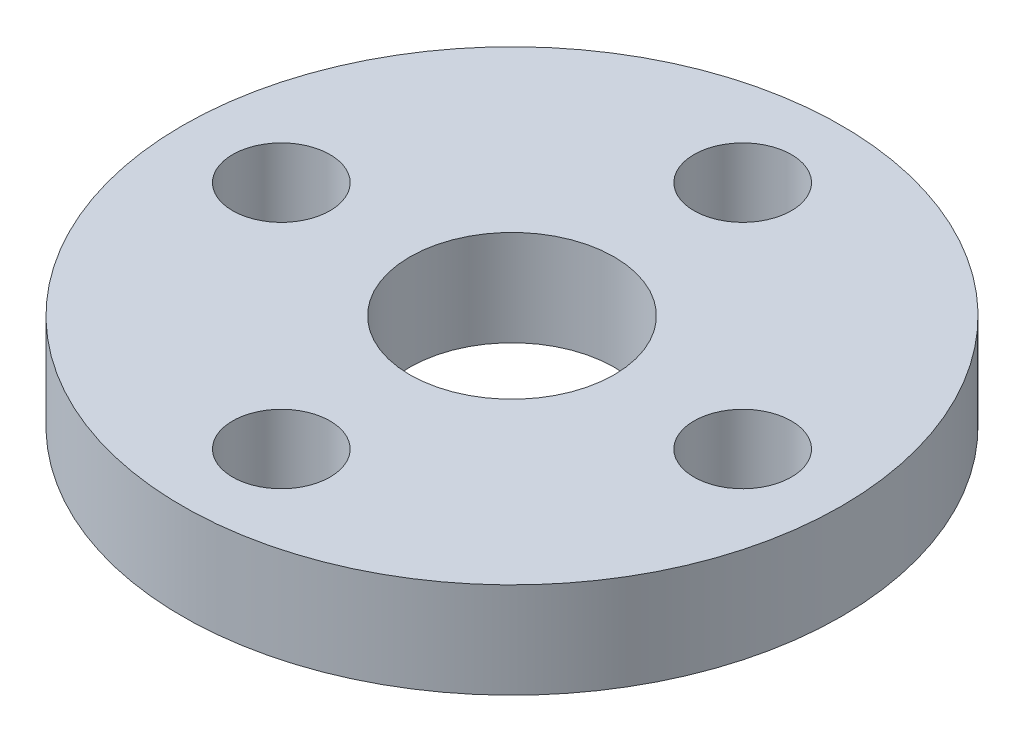
ISO-10303-21;
HEADER;
FILE_DESCRIPTION(('STEP AP214'),'2;1');
FILE_NAME('part.step','',(''),(''),'','','');
FILE_SCHEMA(('AUTOMOTIVE_DESIGN { 1 0 10303 214 1 1 1 1 }'));
ENDSEC;
DATA;
#1=APPLICATION_CONTEXT('core data for automotive mechanical design processes');
#2=APPLICATION_PROTOCOL_DEFINITION('international standard','automotive_design',2000,#1);
#3=PRODUCT_CONTEXT('',#1,'mechanical');
#4=PRODUCT('Part','Part','',(#3));
#5=PRODUCT_RELATED_PRODUCT_CATEGORY('part','',(#4));
#6=PRODUCT_DEFINITION_FORMATION('','',#4);
#7=PRODUCT_DEFINITION_CONTEXT('part definition',#1,'design');
#8=PRODUCT_DEFINITION('design','',#6,#7);
#9=PRODUCT_DEFINITION_SHAPE('','',#8);
#10=(LENGTH_UNIT() NAMED_UNIT(*) SI_UNIT(.MILLI.,.METRE.));
#11=(NAMED_UNIT(*) PLANE_ANGLE_UNIT() SI_UNIT($,.RADIAN.));
#12=(NAMED_UNIT(*) SI_UNIT($,.STERADIAN.) SOLID_ANGLE_UNIT());
#13=UNCERTAINTY_MEASURE_WITH_UNIT(LENGTH_MEASURE(1.E-05),#10,'distance_accuracy_value','');
#14=(GEOMETRIC_REPRESENTATION_CONTEXT(3) GLOBAL_UNCERTAINTY_ASSIGNED_CONTEXT((#13)) GLOBAL_UNIT_ASSIGNED_CONTEXT((#10,
#11,#12)) REPRESENTATION_CONTEXT('',''));
#15=CARTESIAN_POINT('',(0.,0.,0.));
#16=DIRECTION('',(0.,0.,1.));
#17=DIRECTION('',(1.,0.,0.));
#18=AXIS2_PLACEMENT_3D('',#15,#16,#17);
#19=CARTESIAN_POINT('',(-45.,-9.45,2.99999999999994));
#20=DIRECTION('',(0.,1.,0.));
#21=DIRECTION('',(0.,0.,1.));
#22=AXIS2_PLACEMENT_3D('',#19,#20,#21);
#23=CYLINDRICAL_SURFACE('',#22,1.47782604588);
#24=CARTESIAN_POINT('',(-45.,-9.45,2.99999999999994));
#25=DIRECTION('',(0.,1.,0.));
#26=DIRECTION('',(-1.,0.,0.));
#27=AXIS2_PLACEMENT_3D('',#24,#25,#26);
#28=CIRCLE('',#27,1.47782604588);
#29=CARTESIAN_POINT('',(-46.47782604588,-9.45,2.99999999999994));
#30=VERTEX_POINT('',#29);
#31=EDGE_CURVE('E24',#30,#30,#28,.T.);
#32=ORIENTED_EDGE('',*,*,#31,.F.);
#33=EDGE_LOOP('',(#32));
#34=FACE_BOUND('',#33,.T.);
#35=CARTESIAN_POINT('',(-45.,-6.55,2.99999999999994));
#36=DIRECTION('',(0.,1.,0.));
#37=DIRECTION('',(-1.,0.,0.));
#38=AXIS2_PLACEMENT_3D('',#35,#36,#37);
#39=CIRCLE('',#38,1.47782604588);
#40=CARTESIAN_POINT('',(-46.47782604588,-6.55,2.99999999999994));
#41=VERTEX_POINT('',#40);
#42=EDGE_CURVE('E49',#41,#41,#39,.T.);
#43=ORIENTED_EDGE('',*,*,#42,.T.);
#44=EDGE_LOOP('',(#43));
#45=FACE_BOUND('',#44,.T.);
#46=ADVANCED_FACE('F15',(#34,#45),#23,.F.);
#47=CARTESIAN_POINT('',(-45.,-9.45,17.));
#48=DIRECTION('',(0.,1.,0.));
#49=DIRECTION('',(0.,0.,1.));
#50=AXIS2_PLACEMENT_3D('',#47,#48,#49);
#51=CYLINDRICAL_SURFACE('',#50,1.47782604588);
#52=CARTESIAN_POINT('',(-45.,-9.45,17.));
#53=DIRECTION('',(0.,1.,0.));
#54=DIRECTION('',(1.,0.,0.));
#55=AXIS2_PLACEMENT_3D('',#52,#53,#54);
#56=CIRCLE('',#55,1.47782604588);
#57=CARTESIAN_POINT('',(-43.52217395412,-9.45,17.));
#58=VERTEX_POINT('',#57);
#59=EDGE_CURVE('E34',#58,#58,#56,.T.);
#60=ORIENTED_EDGE('',*,*,#59,.F.);
#61=EDGE_LOOP('',(#60));
#62=FACE_BOUND('',#61,.T.);
#63=CARTESIAN_POINT('',(-45.,-6.55,17.));
#64=DIRECTION('',(0.,1.,0.));
#65=DIRECTION('',(1.,0.,0.));
#66=AXIS2_PLACEMENT_3D('',#63,#64,#65);
#67=CIRCLE('',#66,1.47782604588);
#68=CARTESIAN_POINT('',(-43.52217395412,-6.55,17.));
#69=VERTEX_POINT('',#68);
#70=EDGE_CURVE('E47',#69,#69,#67,.T.);
#71=ORIENTED_EDGE('',*,*,#70,.T.);
#72=EDGE_LOOP('',(#71));
#73=FACE_BOUND('',#72,.T.);
#74=ADVANCED_FACE('F81',(#62,#73),#51,.F.);
#75=CARTESIAN_POINT('',(-38.,-9.45,10.));
#76=DIRECTION('',(0.,1.,0.));
#77=DIRECTION('',(0.,0.,1.));
#78=AXIS2_PLACEMENT_3D('',#75,#76,#77);
#79=CYLINDRICAL_SURFACE('',#78,1.47782604588);
#80=CARTESIAN_POINT('',(-38.,-9.45,10.));
#81=DIRECTION('',(0.,1.,0.));
#82=DIRECTION('',(0.,0.,-1.));
#83=AXIS2_PLACEMENT_3D('',#80,#81,#82);
#84=CIRCLE('',#83,1.47782604588);
#85=CARTESIAN_POINT('',(-38.,-9.45,8.52217395412));
#86=VERTEX_POINT('',#85);
#87=EDGE_CURVE('E63',#86,#86,#84,.T.);
#88=ORIENTED_EDGE('',*,*,#87,.F.);
#89=EDGE_LOOP('',(#88));
#90=FACE_BOUND('',#89,.T.);
#91=CARTESIAN_POINT('',(-38.,-6.55,10.));
#92=DIRECTION('',(0.,1.,0.));
#93=DIRECTION('',(0.,0.,-1.));
#94=AXIS2_PLACEMENT_3D('',#91,#92,#93);
#95=CIRCLE('',#94,1.47782604588);
#96=CARTESIAN_POINT('',(-38.,-6.55,8.52217395412));
#97=VERTEX_POINT('',#96);
#98=EDGE_CURVE('E42',#97,#97,#95,.T.);
#99=ORIENTED_EDGE('',*,*,#98,.T.);
#100=EDGE_LOOP('',(#99));
#101=FACE_BOUND('',#100,.T.);
#102=ADVANCED_FACE('F84',(#90,#101),#79,.F.);
#103=CARTESIAN_POINT('',(-45.,-9.45,10.));
#104=DIRECTION('',(0.,1.,0.));
#105=DIRECTION('',(0.,0.,1.));
#106=AXIS2_PLACEMENT_3D('',#103,#104,#105);
#107=CYLINDRICAL_SURFACE('',#106,10.);
#108=CARTESIAN_POINT('',(-45.,-9.45,10.));
#109=DIRECTION('',(0.,-1.,0.));
#110=DIRECTION('',(1.,0.,0.));
#111=AXIS2_PLACEMENT_3D('',#108,#109,#110);
#112=CIRCLE('',#111,10.);
#113=CARTESIAN_POINT('',(-35.,-9.45,10.));
#114=VERTEX_POINT('',#113);
#115=EDGE_CURVE('E57',#114,#114,#112,.T.);
#116=ORIENTED_EDGE('',*,*,#115,.F.);
#117=EDGE_LOOP('',(#116));
#118=FACE_BOUND('',#117,.T.);
#119=CARTESIAN_POINT('',(-45.,-6.55,10.));
#120=DIRECTION('',(0.,-1.,0.));
#121=DIRECTION('',(1.,0.,0.));
#122=AXIS2_PLACEMENT_3D('',#119,#120,#121);
#123=CIRCLE('',#122,10.);
#124=CARTESIAN_POINT('',(-35.,-6.55,10.));
#125=VERTEX_POINT('',#124);
#126=EDGE_CURVE('E38',#125,#125,#123,.T.);
#127=ORIENTED_EDGE('',*,*,#126,.T.);
#128=EDGE_LOOP('',(#127));
#129=FACE_BOUND('',#128,.T.);
#130=ADVANCED_FACE('F17',(#118,#129),#107,.T.);
#131=CARTESIAN_POINT('',(-52.,-9.45,10.));
#132=DIRECTION('',(0.,1.,0.));
#133=DIRECTION('',(0.,0.,1.));
#134=AXIS2_PLACEMENT_3D('',#131,#132,#133);
#135=CYLINDRICAL_SURFACE('',#134,1.47782604588);
#136=CARTESIAN_POINT('',(-52.,-9.45,10.));
#137=DIRECTION('',(0.,-1.,0.));
#138=DIRECTION('',(0.,0.,1.));
#139=AXIS2_PLACEMENT_3D('',#136,#137,#138);
#140=CIRCLE('',#139,1.47782604588);
#141=CARTESIAN_POINT('',(-52.,-9.45,11.47782604588));
#142=VERTEX_POINT('',#141);
#143=EDGE_CURVE('E10',#142,#142,#140,.T.);
#144=ORIENTED_EDGE('',*,*,#143,.T.);
#145=EDGE_LOOP('',(#144));
#146=FACE_BOUND('',#145,.T.);
#147=CARTESIAN_POINT('',(-52.,-6.55,10.));
#148=DIRECTION('',(0.,-1.,0.));
#149=DIRECTION('',(0.,0.,1.));
#150=AXIS2_PLACEMENT_3D('',#147,#148,#149);
#151=CIRCLE('',#150,1.47782604588);
#152=CARTESIAN_POINT('',(-52.,-6.55,11.47782604588));
#153=VERTEX_POINT('',#152);
#154=EDGE_CURVE('E19',#153,#153,#151,.T.);
#155=ORIENTED_EDGE('',*,*,#154,.F.);
#156=EDGE_LOOP('',(#155));
#157=FACE_BOUND('',#156,.T.);
#158=ADVANCED_FACE('F101',(#146,#157),#135,.F.);
#159=CARTESIAN_POINT('',(-41.5,-9.45,10.));
#160=DIRECTION('',(0.,-1.,0.));
#161=DIRECTION('',(0.,0.,-1.));
#162=AXIS2_PLACEMENT_3D('',#159,#160,#161);
#163=PLANE('',#162);
#164=CARTESIAN_POINT('',(-45.,-9.45,10.));
#165=DIRECTION('',(0.,-1.,0.));
#166=DIRECTION('',(0.,0.,-1.));
#167=AXIS2_PLACEMENT_3D('',#164,#165,#166);
#168=CIRCLE('',#167,3.1);
#169=CARTESIAN_POINT('',(-45.,-9.45,6.9));
#170=VERTEX_POINT('',#169);
#171=EDGE_CURVE('E72',#170,#170,#168,.T.);
#172=ORIENTED_EDGE('',*,*,#171,.F.);
#173=EDGE_LOOP('',(#172));
#174=FACE_BOUND('',#173,.T.);
#175=ORIENTED_EDGE('',*,*,#115,.T.);
#176=EDGE_LOOP('',(#175));
#177=FACE_BOUND('',#176,.T.);
#178=ORIENTED_EDGE('',*,*,#87,.T.);
#179=EDGE_LOOP('',(#178));
#180=FACE_BOUND('',#179,.T.);
#181=ORIENTED_EDGE('',*,*,#59,.T.);
#182=EDGE_LOOP('',(#181));
#183=FACE_BOUND('',#182,.T.);
#184=ORIENTED_EDGE('',*,*,#31,.T.);
#185=EDGE_LOOP('',(#184));
#186=FACE_BOUND('',#185,.T.);
#187=ORIENTED_EDGE('',*,*,#143,.F.);
#188=EDGE_LOOP('',(#187));
#189=FACE_BOUND('',#188,.T.);
#190=ADVANCED_FACE('F78',(#174,#177,#180,#183,#186,#189),#163,.T.);
#191=CARTESIAN_POINT('',(-41.5,-6.55,10.));
#192=DIRECTION('',(0.,-1.,0.));
#193=DIRECTION('',(0.,0.,-1.));
#194=AXIS2_PLACEMENT_3D('',#191,#192,#193);
#195=PLANE('',#194);
#196=CARTESIAN_POINT('',(-45.,-6.55,10.));
#197=DIRECTION('',(0.,-1.,0.));
#198=DIRECTION('',(1.,0.,0.));
#199=AXIS2_PLACEMENT_3D('',#196,#197,#198);
#200=CIRCLE('',#199,3.1);
#201=CARTESIAN_POINT('',(-41.9,-6.55,10.));
#202=VERTEX_POINT('',#201);
#203=EDGE_CURVE('E43',#202,#202,#200,.T.);
#204=ORIENTED_EDGE('',*,*,#203,.T.);
#205=EDGE_LOOP('',(#204));
#206=FACE_BOUND('',#205,.T.);
#207=ORIENTED_EDGE('',*,*,#126,.F.);
#208=EDGE_LOOP('',(#207));
#209=FACE_BOUND('',#208,.T.);
#210=ORIENTED_EDGE('',*,*,#98,.F.);
#211=EDGE_LOOP('',(#210));
#212=FACE_BOUND('',#211,.T.);
#213=ORIENTED_EDGE('',*,*,#70,.F.);
#214=EDGE_LOOP('',(#213));
#215=FACE_BOUND('',#214,.T.);
#216=ORIENTED_EDGE('',*,*,#42,.F.);
#217=EDGE_LOOP('',(#216));
#218=FACE_BOUND('',#217,.T.);
#219=ORIENTED_EDGE('',*,*,#154,.T.);
#220=EDGE_LOOP('',(#219));
#221=FACE_BOUND('',#220,.T.);
#222=ADVANCED_FACE('F88',(#206,#209,#212,#215,#218,#221),#195,.F.);
#223=CARTESIAN_POINT('',(-45.,-9.74,10.));
#224=DIRECTION('',(0.,1.,0.));
#225=DIRECTION('',(0.,0.,1.));
#226=AXIS2_PLACEMENT_3D('',#223,#224,#225);
#227=CYLINDRICAL_SURFACE('',#226,3.1);
#228=ORIENTED_EDGE('',*,*,#203,.F.);
#229=EDGE_LOOP('',(#228));
#230=FACE_BOUND('',#229,.T.);
#231=ORIENTED_EDGE('',*,*,#171,.T.);
#232=EDGE_LOOP('',(#231));
#233=FACE_BOUND('',#232,.T.);
#234=ADVANCED_FACE('F91',(#230,#233),#227,.F.);
#235=CLOSED_SHELL('',(#46,#74,#102,#130,#158,#190,#222,#234));
#236=MANIFOLD_SOLID_BREP('B1',#235);
#237=ADVANCED_BREP_SHAPE_REPRESENTATION('',(#18,#236),#14);
#238=SHAPE_DEFINITION_REPRESENTATION(#9,#237);
ENDSEC;
END-ISO-10303-21;
